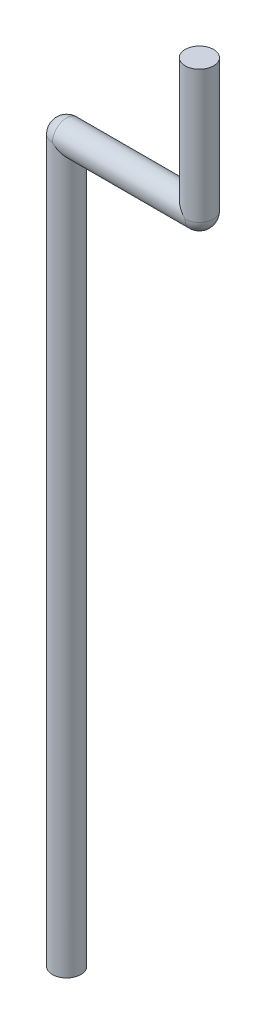
ISO-10303-21;
HEADER;
FILE_DESCRIPTION(('STEP AP214'),'2;1');
FILE_NAME('part.step','',(''),(''),'','','');
FILE_SCHEMA(('AUTOMOTIVE_DESIGN { 1 0 10303 214 1 1 1 1 }'));
ENDSEC;
DATA;
#1=APPLICATION_CONTEXT('core data for automotive mechanical design processes');
#2=APPLICATION_PROTOCOL_DEFINITION('international standard','automotive_design',2000,#1);
#3=PRODUCT_CONTEXT('',#1,'mechanical');
#4=PRODUCT('Part','Part','',(#3));
#5=PRODUCT_RELATED_PRODUCT_CATEGORY('part','',(#4));
#6=PRODUCT_DEFINITION_FORMATION('','',#4);
#7=PRODUCT_DEFINITION_CONTEXT('part definition',#1,'design');
#8=PRODUCT_DEFINITION('design','',#6,#7);
#9=PRODUCT_DEFINITION_SHAPE('','',#8);
#10=(LENGTH_UNIT() NAMED_UNIT(*) SI_UNIT(.MILLI.,.METRE.));
#11=(NAMED_UNIT(*) PLANE_ANGLE_UNIT() SI_UNIT($,.RADIAN.));
#12=(NAMED_UNIT(*) SI_UNIT($,.STERADIAN.) SOLID_ANGLE_UNIT());
#13=UNCERTAINTY_MEASURE_WITH_UNIT(LENGTH_MEASURE(1.E-05),#10,'distance_accuracy_value','');
#14=(GEOMETRIC_REPRESENTATION_CONTEXT(3) GLOBAL_UNCERTAINTY_ASSIGNED_CONTEXT((#13)) GLOBAL_UNIT_ASSIGNED_CONTEXT((#10,
#11,#12)) REPRESENTATION_CONTEXT('',''));
#15=CARTESIAN_POINT('',(0.,0.,0.));
#16=DIRECTION('',(0.,0.,1.));
#17=DIRECTION('',(1.,0.,0.));
#18=AXIS2_PLACEMENT_3D('',#15,#16,#17);
#19=CARTESIAN_POINT('',(7.,38.,0.));
#20=DIRECTION('',(-1.,0.,0.));
#21=DIRECTION('',(0.,0.,1.));
#22=AXIS2_PLACEMENT_3D('',#19,#20,#21);
#23=CYLINDRICAL_SURFACE('',#22,0.75);
#24=CARTESIAN_POINT('',(0.,38.,0.));
#25=DIRECTION('',(1.,0.,0.));
#26=DIRECTION('',(0.,0.,-1.));
#27=AXIS2_PLACEMENT_3D('',#24,#25,#26);
#28=CIRCLE('',#27,0.75);
#29=CARTESIAN_POINT('',(0.,38.,-0.75));
#30=VERTEX_POINT('',#29);
#31=CARTESIAN_POINT('',(0.,38.,0.75));
#32=VERTEX_POINT('',#31);
#33=EDGE_CURVE('E54',#30,#32,#28,.T.);
#34=ORIENTED_EDGE('',*,*,#33,.T.);
#35=CARTESIAN_POINT('',(0.,38.,0.));
#36=DIRECTION('',(-0.707106781186547,-0.707106781186547,0.));
#37=DIRECTION('',(0.707106781186547,-0.707106781186547,0.));
#38=AXIS2_PLACEMENT_3D('',#35,#36,#37);
#39=ELLIPSE('',#38,1.06066017177982,0.75);
#40=EDGE_CURVE('E64',#32,#30,#39,.F.);
#41=ORIENTED_EDGE('',*,*,#40,.T.);
#42=EDGE_LOOP('',(#34,#41));
#43=FACE_BOUND('',#42,.T.);
#44=CARTESIAN_POINT('',(7.,38.,0.));
#45=DIRECTION('',(-0.707106781186547,-0.707106781186547,0.));
#46=DIRECTION('',(-0.707106781186547,0.707106781186547,0.));
#47=AXIS2_PLACEMENT_3D('',#44,#45,#46);
#48=ELLIPSE('',#47,1.06066017177982,0.75);
#49=CARTESIAN_POINT('',(7.,38.,-0.749999999999999));
#50=VERTEX_POINT('',#49);
#51=CARTESIAN_POINT('',(7.,38.,0.75));
#52=VERTEX_POINT('',#51);
#53=EDGE_CURVE('E66',#50,#52,#48,.F.);
#54=ORIENTED_EDGE('',*,*,#53,.F.);
#55=CARTESIAN_POINT('',(7.,38.,0.));
#56=DIRECTION('',(1.,0.,0.));
#57=DIRECTION('',(0.,0.,-1.));
#58=AXIS2_PLACEMENT_3D('',#55,#56,#57);
#59=CIRCLE('',#58,0.75);
#60=EDGE_CURVE('E59',#52,#50,#59,.T.);
#61=ORIENTED_EDGE('',*,*,#60,.F.);
#62=EDGE_LOOP('',(#54,#61));
#63=FACE_BOUND('',#62,.T.);
#64=ADVANCED_FACE('F34',(#43,#63),#23,.T.);
#65=CARTESIAN_POINT('',(7.,38.,0.));
#66=DIRECTION('',(0.,1.,0.));
#67=DIRECTION('',(0.,0.,1.));
#68=AXIS2_PLACEMENT_3D('',#65,#66,#67);
#69=SPHERICAL_SURFACE('',#68,0.750000000000001);
#70=CARTESIAN_POINT('',(7.,38.,0.));
#71=DIRECTION('',(0.,1.,0.));
#72=DIRECTION('',(0.,0.,1.));
#73=AXIS2_PLACEMENT_3D('',#70,#71,#72);
#74=CIRCLE('',#73,0.749999999999999);
#75=EDGE_CURVE('E48',#52,#50,#74,.T.);
#76=ORIENTED_EDGE('',*,*,#75,.F.);
#77=ORIENTED_EDGE('',*,*,#60,.T.);
#78=EDGE_LOOP('',(#76,#77));
#79=FACE_BOUND('',#78,.T.);
#80=ADVANCED_FACE('F61',(#79),#69,.T.);
#81=CARTESIAN_POINT('',(0.,38.,0.));
#82=DIRECTION('',(0.,-1.,0.));
#83=DIRECTION('',(0.,0.,-1.));
#84=AXIS2_PLACEMENT_3D('',#81,#82,#83);
#85=CYLINDRICAL_SURFACE('',#84,0.75);
#86=CARTESIAN_POINT('',(0.,0.,0.));
#87=DIRECTION('',(0.,1.,0.));
#88=DIRECTION('',(0.,0.,1.));
#89=AXIS2_PLACEMENT_3D('',#86,#87,#88);
#90=CIRCLE('',#89,0.75);
#91=CARTESIAN_POINT('',(0.,0.,0.75));
#92=VERTEX_POINT('',#91);
#93=EDGE_CURVE('E38',#92,#92,#90,.T.);
#94=ORIENTED_EDGE('',*,*,#93,.T.);
#95=EDGE_LOOP('',(#94));
#96=FACE_BOUND('',#95,.T.);
#97=ORIENTED_EDGE('',*,*,#40,.F.);
#98=CARTESIAN_POINT('',(0.,38.,0.));
#99=DIRECTION('',(0.,1.,0.));
#100=DIRECTION('',(0.,0.,1.));
#101=AXIS2_PLACEMENT_3D('',#98,#99,#100);
#102=CIRCLE('',#101,0.75);
#103=EDGE_CURVE('E11',#30,#32,#102,.T.);
#104=ORIENTED_EDGE('',*,*,#103,.F.);
#105=EDGE_LOOP('',(#97,#104));
#106=FACE_BOUND('',#105,.T.);
#107=ADVANCED_FACE('F36',(#96,#106),#85,.T.);
#108=CARTESIAN_POINT('',(0.,38.,0.));
#109=DIRECTION('',(0.,1.,0.));
#110=DIRECTION('',(1.,0.,0.));
#111=AXIS2_PLACEMENT_3D('',#108,#109,#110);
#112=SPHERICAL_SURFACE('',#111,0.750000000000001);
#113=ORIENTED_EDGE('',*,*,#33,.F.);
#114=ORIENTED_EDGE('',*,*,#103,.T.);
#115=EDGE_LOOP('',(#113,#114));
#116=FACE_BOUND('',#115,.T.);
#117=ADVANCED_FACE('F86',(#116),#112,.T.);
#118=CARTESIAN_POINT('',(0.,0.,0.));
#119=DIRECTION('',(0.,1.,0.));
#120=DIRECTION('',(0.,0.,1.));
#121=AXIS2_PLACEMENT_3D('',#118,#119,#120);
#122=PLANE('',#121);
#123=ORIENTED_EDGE('',*,*,#93,.F.);
#124=EDGE_LOOP('',(#123));
#125=FACE_BOUND('',#124,.T.);
#126=ADVANCED_FACE('F84',(#125),#122,.F.);
#127=CARTESIAN_POINT('',(7.,45.,0.));
#128=DIRECTION('',(0.,-1.,0.));
#129=DIRECTION('',(0.,0.,-1.));
#130=AXIS2_PLACEMENT_3D('',#127,#128,#129);
#131=CYLINDRICAL_SURFACE('',#130,0.749999999999999);
#132=CARTESIAN_POINT('',(7.,45.,0.));
#133=DIRECTION('',(0.,1.,0.));
#134=DIRECTION('',(0.,0.,1.));
#135=AXIS2_PLACEMENT_3D('',#132,#133,#134);
#136=CIRCLE('',#135,0.749999999999999);
#137=CARTESIAN_POINT('',(7.,45.,0.749999999999999));
#138=VERTEX_POINT('',#137);
#139=EDGE_CURVE('E68',#138,#138,#136,.T.);
#140=ORIENTED_EDGE('',*,*,#139,.F.);
#141=EDGE_LOOP('',(#140));
#142=FACE_BOUND('',#141,.T.);
#143=ORIENTED_EDGE('',*,*,#75,.T.);
#144=ORIENTED_EDGE('',*,*,#53,.T.);
#145=EDGE_LOOP('',(#143,#144));
#146=FACE_BOUND('',#145,.T.);
#147=ADVANCED_FACE('F70',(#142,#146),#131,.T.);
#148=CARTESIAN_POINT('',(7.,45.,0.));
#149=DIRECTION('',(0.,1.,0.));
#150=DIRECTION('',(0.,0.,1.));
#151=AXIS2_PLACEMENT_3D('',#148,#149,#150);
#152=PLANE('',#151);
#153=ORIENTED_EDGE('',*,*,#139,.T.);
#154=EDGE_LOOP('',(#153));
#155=FACE_BOUND('',#154,.T.);
#156=ADVANCED_FACE('F91',(#155),#152,.T.);
#157=CLOSED_SHELL('',(#64,#80,#107,#117,#126,#147,#156));
#158=MANIFOLD_SOLID_BREP('B2',#157);
#159=ADVANCED_BREP_SHAPE_REPRESENTATION('',(#18,#158),#14);
#160=SHAPE_DEFINITION_REPRESENTATION(#9,#159);
ENDSEC;
END-ISO-10303-21;
